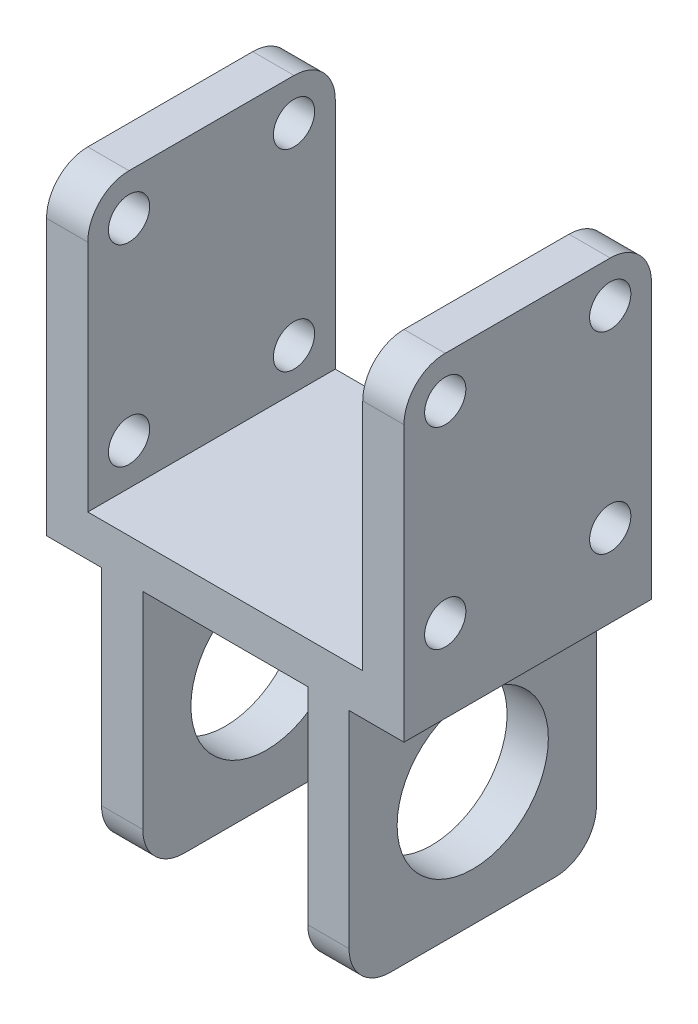
ISO-10303-21;
HEADER;
FILE_DESCRIPTION(('STEP AP214'),'2;1');
FILE_NAME('part.step','',(''),(''),'','','');
FILE_SCHEMA(('AUTOMOTIVE_DESIGN { 1 0 10303 214 1 1 1 1 }'));
ENDSEC;
DATA;
#1=APPLICATION_CONTEXT('core data for automotive mechanical design processes');
#2=APPLICATION_PROTOCOL_DEFINITION('international standard','automotive_design',2000,#1);
#3=PRODUCT_CONTEXT('',#1,'mechanical');
#4=PRODUCT('Part','Part','',(#3));
#5=PRODUCT_RELATED_PRODUCT_CATEGORY('part','',(#4));
#6=PRODUCT_DEFINITION_FORMATION('','',#4);
#7=PRODUCT_DEFINITION_CONTEXT('part definition',#1,'design');
#8=PRODUCT_DEFINITION('design','',#6,#7);
#9=PRODUCT_DEFINITION_SHAPE('','',#8);
#10=(LENGTH_UNIT() NAMED_UNIT(*) SI_UNIT(.MILLI.,.METRE.));
#11=(NAMED_UNIT(*) PLANE_ANGLE_UNIT() SI_UNIT($,.RADIAN.));
#12=(NAMED_UNIT(*) SI_UNIT($,.STERADIAN.) SOLID_ANGLE_UNIT());
#13=UNCERTAINTY_MEASURE_WITH_UNIT(LENGTH_MEASURE(1.E-05),#10,'distance_accuracy_value','');
#14=(GEOMETRIC_REPRESENTATION_CONTEXT(3) GLOBAL_UNCERTAINTY_ASSIGNED_CONTEXT((#13)) GLOBAL_UNIT_ASSIGNED_CONTEXT((#10,
#11,#12)) REPRESENTATION_CONTEXT('',''));
#15=CARTESIAN_POINT('',(0.,0.,0.));
#16=DIRECTION('',(0.,0.,1.));
#17=DIRECTION('',(1.,0.,0.));
#18=AXIS2_PLACEMENT_3D('',#15,#16,#17);
#19=CARTESIAN_POINT('',(0.,0.,0.));
#20=DIRECTION('',(0.,-1.,0.));
#21=DIRECTION('',(0.,0.,-1.));
#22=AXIS2_PLACEMENT_3D('',#19,#20,#21);
#23=PLANE('',#22);
#24=DIRECTION('',(1.,0.,0.));
#25=VECTOR('',#24,1.);
#26=CARTESIAN_POINT('',(-13.,0.,9.));
#27=LINE('',#26,#25);
#28=CARTESIAN_POINT('',(9.,0.,9.));
#29=VERTEX_POINT('',#28);
#30=CARTESIAN_POINT('',(13.,0.,9.));
#31=VERTEX_POINT('',#30);
#32=EDGE_CURVE('E200',#29,#31,#27,.T.);
#33=ORIENTED_EDGE('',*,*,#32,.F.);
#34=DIRECTION('',(0.,0.,1.));
#35=VECTOR('',#34,1.);
#36=CARTESIAN_POINT('',(9.,0.,9.));
#37=LINE('',#36,#35);
#38=CARTESIAN_POINT('',(9.,0.,-9.));
#39=VERTEX_POINT('',#38);
#40=EDGE_CURVE('E210',#39,#29,#37,.T.);
#41=ORIENTED_EDGE('',*,*,#40,.F.);
#42=DIRECTION('',(-1.,0.,0.));
#43=VECTOR('',#42,1.);
#44=CARTESIAN_POINT('',(-13.,0.,-9.));
#45=LINE('',#44,#43);
#46=CARTESIAN_POINT('',(13.,0.,-9.));
#47=VERTEX_POINT('',#46);
#48=EDGE_CURVE('E228',#47,#39,#45,.T.);
#49=ORIENTED_EDGE('',*,*,#48,.F.);
#50=DIRECTION('',(0.,0.,-1.));
#51=VECTOR('',#50,1.);
#52=CARTESIAN_POINT('',(13.,0.,9.));
#53=LINE('',#52,#51);
#54=EDGE_CURVE('E221',#31,#47,#53,.T.);
#55=ORIENTED_EDGE('',*,*,#54,.F.);
#56=EDGE_LOOP('',(#33,#41,#49,#55));
#57=FACE_BOUND('',#56,.T.);
#58=ADVANCED_FACE('F35',(#57),#23,.T.);
#59=CARTESIAN_POINT('',(5.99999999999999,0.,-9.));
#60=VERTEX_POINT('',#59);
#61=CARTESIAN_POINT('',(-6.,0.,-9.));
#62=VERTEX_POINT('',#61);
#63=EDGE_CURVE('E252',#60,#62,#45,.T.);
#64=ORIENTED_EDGE('',*,*,#63,.F.);
#65=DIRECTION('',(0.,0.,-1.));
#66=VECTOR('',#65,1.);
#67=CARTESIAN_POINT('',(6.,0.,9.));
#68=LINE('',#67,#66);
#69=CARTESIAN_POINT('',(6.,0.,9.));
#70=VERTEX_POINT('',#69);
#71=EDGE_CURVE('E217',#70,#60,#68,.T.);
#72=ORIENTED_EDGE('',*,*,#71,.F.);
#73=CARTESIAN_POINT('',(-6.,0.,9.));
#74=VERTEX_POINT('',#73);
#75=EDGE_CURVE('E222',#74,#70,#27,.T.);
#76=ORIENTED_EDGE('',*,*,#75,.F.);
#77=DIRECTION('',(0.,0.,1.));
#78=VECTOR('',#77,1.);
#79=CARTESIAN_POINT('',(-6.,0.,9.));
#80=LINE('',#79,#78);
#81=EDGE_CURVE('E395',#62,#74,#80,.T.);
#82=ORIENTED_EDGE('',*,*,#81,.F.);
#83=EDGE_LOOP('',(#64,#72,#76,#82));
#84=FACE_BOUND('',#83,.T.);
#85=ADVANCED_FACE('F471',(#84),#23,.T.);
#86=DIRECTION('',(0.,0.,-1.));
#87=VECTOR('',#86,1.);
#88=CARTESIAN_POINT('',(-9.,0.,9.));
#89=LINE('',#88,#87);
#90=CARTESIAN_POINT('',(-9.,0.,9.));
#91=VERTEX_POINT('',#90);
#92=CARTESIAN_POINT('',(-9.,0.,-9.));
#93=VERTEX_POINT('',#92);
#94=EDGE_CURVE('E206',#91,#93,#89,.T.);
#95=ORIENTED_EDGE('',*,*,#94,.F.);
#96=CARTESIAN_POINT('',(-13.,0.,9.));
#97=VERTEX_POINT('',#96);
#98=EDGE_CURVE('E225',#97,#91,#27,.T.);
#99=ORIENTED_EDGE('',*,*,#98,.F.);
#100=DIRECTION('',(0.,0.,1.));
#101=VECTOR('',#100,1.);
#102=CARTESIAN_POINT('',(-13.,0.,9.));
#103=LINE('',#102,#101);
#104=CARTESIAN_POINT('',(-13.,0.,-9.));
#105=VERTEX_POINT('',#104);
#106=EDGE_CURVE('E223',#105,#97,#103,.T.);
#107=ORIENTED_EDGE('',*,*,#106,.F.);
#108=EDGE_CURVE('E251',#93,#105,#45,.T.);
#109=ORIENTED_EDGE('',*,*,#108,.F.);
#110=EDGE_LOOP('',(#95,#99,#107,#109));
#111=FACE_BOUND('',#110,.T.);
#112=ADVANCED_FACE('F265',(#111),#23,.T.);
#113=CARTESIAN_POINT('',(0.,3.,0.));
#114=DIRECTION('',(0.,-1.,0.));
#115=DIRECTION('',(0.,0.,-1.));
#116=AXIS2_PLACEMENT_3D('',#113,#114,#115);
#117=PLANE('',#116);
#118=DIRECTION('',(0.,0.,1.));
#119=VECTOR('',#118,1.);
#120=CARTESIAN_POINT('',(10.,3.,-9.));
#121=LINE('',#120,#119);
#122=CARTESIAN_POINT('',(9.99999999999999,3.,-9.));
#123=VERTEX_POINT('',#122);
#124=CARTESIAN_POINT('',(9.99999999999999,3.,9.));
#125=VERTEX_POINT('',#124);
#126=EDGE_CURVE('E408',#123,#125,#121,.T.);
#127=ORIENTED_EDGE('',*,*,#126,.F.);
#128=DIRECTION('',(-1.,0.,0.));
#129=VECTOR('',#128,1.);
#130=CARTESIAN_POINT('',(-13.,3.,-9.));
#131=LINE('',#130,#129);
#132=CARTESIAN_POINT('',(-10.,3.,-9.));
#133=VERTEX_POINT('',#132);
#134=EDGE_CURVE('E232',#123,#133,#131,.T.);
#135=ORIENTED_EDGE('',*,*,#134,.T.);
#136=DIRECTION('',(0.,0.,-1.));
#137=VECTOR('',#136,1.);
#138=CARTESIAN_POINT('',(-10.,3.,-9.));
#139=LINE('',#138,#137);
#140=CARTESIAN_POINT('',(-10.,3.,9.));
#141=VERTEX_POINT('',#140);
#142=EDGE_CURVE('E421',#141,#133,#139,.T.);
#143=ORIENTED_EDGE('',*,*,#142,.F.);
#144=DIRECTION('',(1.,0.,0.));
#145=VECTOR('',#144,1.);
#146=CARTESIAN_POINT('',(-13.,3.,9.));
#147=LINE('',#146,#145);
#148=EDGE_CURVE('E236',#141,#125,#147,.T.);
#149=ORIENTED_EDGE('',*,*,#148,.T.);
#150=EDGE_LOOP('',(#127,#135,#143,#149));
#151=FACE_BOUND('',#150,.T.);
#152=ADVANCED_FACE('F436',(#151),#117,.F.);
#153=CARTESIAN_POINT('',(13.,3.,9.));
#154=DIRECTION('',(-1.,0.,0.));
#155=DIRECTION('',(0.,0.,1.));
#156=AXIS2_PLACEMENT_3D('',#153,#154,#155);
#157=PLANE('',#156);
#158=CARTESIAN_POINT('',(13.,6.,-6.));
#159=DIRECTION('',(-1.,0.,0.));
#160=DIRECTION('',(0.,0.,-1.));
#161=AXIS2_PLACEMENT_3D('',#158,#159,#160);
#162=CIRCLE('',#161,1.5);
#163=CARTESIAN_POINT('',(13.,6.,-7.5));
#164=VERTEX_POINT('',#163);
#165=EDGE_CURVE('E563',#164,#164,#162,.T.);
#166=ORIENTED_EDGE('',*,*,#165,.T.);
#167=EDGE_LOOP('',(#166));
#168=FACE_BOUND('',#167,.T.);
#169=CARTESIAN_POINT('',(13.,6.,6.));
#170=DIRECTION('',(-1.,0.,0.));
#171=DIRECTION('',(0.,0.,1.));
#172=AXIS2_PLACEMENT_3D('',#169,#170,#171);
#173=CIRCLE('',#172,1.5);
#174=CARTESIAN_POINT('',(13.,6.,7.5));
#175=VERTEX_POINT('',#174);
#176=EDGE_CURVE('E575',#175,#175,#173,.T.);
#177=ORIENTED_EDGE('',*,*,#176,.T.);
#178=EDGE_LOOP('',(#177));
#179=FACE_BOUND('',#178,.T.);
#180=CARTESIAN_POINT('',(13.,20.,6.));
#181=DIRECTION('',(-1.,0.,0.));
#182=DIRECTION('',(0.,0.,-1.));
#183=AXIS2_PLACEMENT_3D('',#180,#181,#182);
#184=CIRCLE('',#183,1.5);
#185=CARTESIAN_POINT('',(13.,20.,4.5));
#186=VERTEX_POINT('',#185);
#187=EDGE_CURVE('E568',#186,#186,#184,.T.);
#188=ORIENTED_EDGE('',*,*,#187,.T.);
#189=EDGE_LOOP('',(#188));
#190=FACE_BOUND('',#189,.T.);
#191=CARTESIAN_POINT('',(13.,20.,-6.));
#192=DIRECTION('',(-1.,0.,0.));
#193=DIRECTION('',(0.,0.,1.));
#194=AXIS2_PLACEMENT_3D('',#191,#192,#193);
#195=CIRCLE('',#194,1.5);
#196=CARTESIAN_POINT('',(13.,20.,-4.5));
#197=VERTEX_POINT('',#196);
#198=EDGE_CURVE('E283',#197,#197,#195,.T.);
#199=ORIENTED_EDGE('',*,*,#198,.T.);
#200=EDGE_LOOP('',(#199));
#201=FACE_BOUND('',#200,.T.);
#202=DIRECTION('',(0.,0.,-1.));
#203=VECTOR('',#202,1.);
#204=CARTESIAN_POINT('',(13.,23.,-9.));
#205=LINE('',#204,#203);
#206=CARTESIAN_POINT('',(13.,23.,6.));
#207=VERTEX_POINT('',#206);
#208=CARTESIAN_POINT('',(13.,23.,-6.));
#209=VERTEX_POINT('',#208);
#210=EDGE_CURVE('E409',#207,#209,#205,.T.);
#211=ORIENTED_EDGE('',*,*,#210,.F.);
#212=CARTESIAN_POINT('',(13.,20.,6.));
#213=DIRECTION('',(-1.,0.,0.));
#214=DIRECTION('',(0.,0.,1.));
#215=AXIS2_PLACEMENT_3D('',#212,#213,#214);
#216=CIRCLE('',#215,3.);
#217=CARTESIAN_POINT('',(13.,20.,9.));
#218=VERTEX_POINT('',#217);
#219=EDGE_CURVE('E302',#207,#218,#216,.F.);
#220=ORIENTED_EDGE('',*,*,#219,.T.);
#221=DIRECTION('',(0.,-1.,0.));
#222=VECTOR('',#221,1.);
#223=CARTESIAN_POINT('',(13.,3.,9.));
#224=LINE('',#223,#222);
#225=EDGE_CURVE('E244',#218,#31,#224,.T.);
#226=ORIENTED_EDGE('',*,*,#225,.T.);
#227=ORIENTED_EDGE('',*,*,#54,.T.);
#228=DIRECTION('',(0.,-1.,0.));
#229=VECTOR('',#228,1.);
#230=CARTESIAN_POINT('',(13.,3.,-9.));
#231=LINE('',#230,#229);
#232=CARTESIAN_POINT('',(13.,20.,-9.));
#233=VERTEX_POINT('',#232);
#234=EDGE_CURVE('E273',#233,#47,#231,.T.);
#235=ORIENTED_EDGE('',*,*,#234,.F.);
#236=CARTESIAN_POINT('',(13.,20.,-6.));
#237=DIRECTION('',(-1.,0.,0.));
#238=DIRECTION('',(0.,0.,1.));
#239=AXIS2_PLACEMENT_3D('',#236,#237,#238);
#240=CIRCLE('',#239,3.);
#241=EDGE_CURVE('E300',#233,#209,#240,.F.);
#242=ORIENTED_EDGE('',*,*,#241,.T.);
#243=EDGE_LOOP('',(#211,#220,#226,#227,#235,#242));
#244=FACE_BOUND('',#243,.T.);
#245=ADVANCED_FACE('F451',(#168,#179,#190,#201,#244),#157,.F.);
#246=CARTESIAN_POINT('',(-13.,3.,-9.));
#247=DIRECTION('',(0.,0.,1.));
#248=DIRECTION('',(1.,0.,0.));
#249=AXIS2_PLACEMENT_3D('',#246,#247,#248);
#250=PLANE('',#249);
#251=DIRECTION('',(0.,1.,0.));
#252=VECTOR('',#251,1.);
#253=CARTESIAN_POINT('',(-6.,-18.,-9.));
#254=LINE('',#253,#252);
#255=CARTESIAN_POINT('',(-6.,-15.,-9.));
#256=VERTEX_POINT('',#255);
#257=EDGE_CURVE('E405',#256,#62,#254,.T.);
#258=ORIENTED_EDGE('',*,*,#257,.F.);
#259=DIRECTION('',(1.,0.,0.));
#260=VECTOR('',#259,1.);
#261=CARTESIAN_POINT('',(-9.,-15.,-9.));
#262=LINE('',#261,#260);
#263=CARTESIAN_POINT('',(-9.,-15.,-9.));
#264=VERTEX_POINT('',#263);
#265=EDGE_CURVE('E11',#256,#264,#262,.F.);
#266=ORIENTED_EDGE('',*,*,#265,.T.);
#267=DIRECTION('',(0.,1.,0.));
#268=VECTOR('',#267,1.);
#269=CARTESIAN_POINT('',(-9.,-18.,-9.));
#270=LINE('',#269,#268);
#271=EDGE_CURVE('E261',#264,#93,#270,.T.);
#272=ORIENTED_EDGE('',*,*,#271,.T.);
#273=ORIENTED_EDGE('',*,*,#108,.T.);
#274=DIRECTION('',(0.,-1.,0.));
#275=VECTOR('',#274,1.);
#276=CARTESIAN_POINT('',(-13.,3.,-9.));
#277=LINE('',#276,#275);
#278=CARTESIAN_POINT('',(-13.,20.,-9.));
#279=VERTEX_POINT('',#278);
#280=EDGE_CURVE('E259',#279,#105,#277,.T.);
#281=ORIENTED_EDGE('',*,*,#280,.F.);
#282=DIRECTION('',(-1.,0.,0.));
#283=VECTOR('',#282,1.);
#284=CARTESIAN_POINT('',(-10.,20.,-9.));
#285=LINE('',#284,#283);
#286=CARTESIAN_POINT('',(-10.,20.,-9.));
#287=VERTEX_POINT('',#286);
#288=EDGE_CURVE('E312',#279,#287,#285,.F.);
#289=ORIENTED_EDGE('',*,*,#288,.T.);
#290=DIRECTION('',(0.,-1.,0.));
#291=VECTOR('',#290,1.);
#292=CARTESIAN_POINT('',(-10.,23.,-9.));
#293=LINE('',#292,#291);
#294=EDGE_CURVE('E428',#287,#133,#293,.T.);
#295=ORIENTED_EDGE('',*,*,#294,.T.);
#296=ORIENTED_EDGE('',*,*,#134,.F.);
#297=DIRECTION('',(0.,-1.,0.));
#298=VECTOR('',#297,1.);
#299=CARTESIAN_POINT('',(10.,23.,-9.));
#300=LINE('',#299,#298);
#301=CARTESIAN_POINT('',(10.,20.,-9.));
#302=VERTEX_POINT('',#301);
#303=EDGE_CURVE('E419',#302,#123,#300,.T.);
#304=ORIENTED_EDGE('',*,*,#303,.F.);
#305=DIRECTION('',(-1.,0.,0.));
#306=VECTOR('',#305,1.);
#307=CARTESIAN_POINT('',(-13.,20.,-9.));
#308=LINE('',#307,#306);
#309=EDGE_CURVE('E314',#302,#233,#308,.F.);
#310=ORIENTED_EDGE('',*,*,#309,.T.);
#311=ORIENTED_EDGE('',*,*,#234,.T.);
#312=ORIENTED_EDGE('',*,*,#48,.T.);
#313=DIRECTION('',(0.,1.,0.));
#314=VECTOR('',#313,1.);
#315=CARTESIAN_POINT('',(9.,-18.,-9.));
#316=LINE('',#315,#314);
#317=CARTESIAN_POINT('',(9.,-15.,-9.));
#318=VERTEX_POINT('',#317);
#319=EDGE_CURVE('E213',#318,#39,#316,.T.);
#320=ORIENTED_EDGE('',*,*,#319,.F.);
#321=DIRECTION('',(1.,0.,0.));
#322=VECTOR('',#321,1.);
#323=CARTESIAN_POINT('',(-13.,-15.,-9.));
#324=LINE('',#323,#322);
#325=CARTESIAN_POINT('',(6.,-15.,-9.));
#326=VERTEX_POINT('',#325);
#327=EDGE_CURVE('E43',#318,#326,#324,.F.);
#328=ORIENTED_EDGE('',*,*,#327,.T.);
#329=DIRECTION('',(0.,1.,0.));
#330=VECTOR('',#329,1.);
#331=CARTESIAN_POINT('',(6.,-18.,-9.));
#332=LINE('',#331,#330);
#333=EDGE_CURVE('E364',#326,#60,#332,.T.);
#334=ORIENTED_EDGE('',*,*,#333,.T.);
#335=ORIENTED_EDGE('',*,*,#63,.T.);
#336=EDGE_LOOP('',(#258,#266,#272,#273,#281,#289,#295,#296,#304,#310,#311,#312,#320,#328,#334,#335));
#337=FACE_BOUND('',#336,.T.);
#338=ADVANCED_FACE('F258',(#337),#250,.F.);
#339=CARTESIAN_POINT('',(-13.,3.,9.));
#340=DIRECTION('',(1.,0.,0.));
#341=DIRECTION('',(0.,0.,-1.));
#342=AXIS2_PLACEMENT_3D('',#339,#340,#341);
#343=PLANE('',#342);
#344=CARTESIAN_POINT('',(-13.,6.,-6.));
#345=DIRECTION('',(-1.,0.,0.));
#346=DIRECTION('',(0.,0.,-1.));
#347=AXIS2_PLACEMENT_3D('',#344,#345,#346);
#348=CIRCLE('',#347,1.5);
#349=CARTESIAN_POINT('',(-13.,6.,-7.5));
#350=VERTEX_POINT('',#349);
#351=EDGE_CURVE('E560',#350,#350,#348,.T.);
#352=ORIENTED_EDGE('',*,*,#351,.F.);
#353=EDGE_LOOP('',(#352));
#354=FACE_BOUND('',#353,.T.);
#355=CARTESIAN_POINT('',(-13.,6.,6.));
#356=DIRECTION('',(-1.,0.,0.));
#357=DIRECTION('',(0.,0.,1.));
#358=AXIS2_PLACEMENT_3D('',#355,#356,#357);
#359=CIRCLE('',#358,1.5);
#360=CARTESIAN_POINT('',(-13.,6.,7.5));
#361=VERTEX_POINT('',#360);
#362=EDGE_CURVE('E578',#361,#361,#359,.T.);
#363=ORIENTED_EDGE('',*,*,#362,.F.);
#364=EDGE_LOOP('',(#363));
#365=FACE_BOUND('',#364,.T.);
#366=CARTESIAN_POINT('',(-13.,20.,6.));
#367=DIRECTION('',(-1.,0.,0.));
#368=DIRECTION('',(0.,0.,-1.));
#369=AXIS2_PLACEMENT_3D('',#366,#367,#368);
#370=CIRCLE('',#369,1.5);
#371=CARTESIAN_POINT('',(-13.,20.,4.5));
#372=VERTEX_POINT('',#371);
#373=EDGE_CURVE('E572',#372,#372,#370,.T.);
#374=ORIENTED_EDGE('',*,*,#373,.F.);
#375=EDGE_LOOP('',(#374));
#376=FACE_BOUND('',#375,.T.);
#377=CARTESIAN_POINT('',(-13.,20.,-6.));
#378=DIRECTION('',(-1.,0.,0.));
#379=DIRECTION('',(0.,0.,1.));
#380=AXIS2_PLACEMENT_3D('',#377,#378,#379);
#381=CIRCLE('',#380,1.5);
#382=CARTESIAN_POINT('',(-13.,20.,-4.5));
#383=VERTEX_POINT('',#382);
#384=EDGE_CURVE('E571',#383,#383,#381,.T.);
#385=ORIENTED_EDGE('',*,*,#384,.F.);
#386=EDGE_LOOP('',(#385));
#387=FACE_BOUND('',#386,.T.);
#388=DIRECTION('',(0.,0.,1.));
#389=VECTOR('',#388,1.);
#390=CARTESIAN_POINT('',(-13.,23.,-9.));
#391=LINE('',#390,#389);
#392=CARTESIAN_POINT('',(-13.,23.,-6.));
#393=VERTEX_POINT('',#392);
#394=CARTESIAN_POINT('',(-13.,23.,6.));
#395=VERTEX_POINT('',#394);
#396=EDGE_CURVE('E422',#393,#395,#391,.T.);
#397=ORIENTED_EDGE('',*,*,#396,.F.);
#398=CARTESIAN_POINT('',(-13.,20.,-6.));
#399=DIRECTION('',(1.,0.,0.));
#400=DIRECTION('',(0.,0.,-1.));
#401=AXIS2_PLACEMENT_3D('',#398,#399,#400);
#402=CIRCLE('',#401,3.);
#403=EDGE_CURVE('E272',#393,#279,#402,.F.);
#404=ORIENTED_EDGE('',*,*,#403,.T.);
#405=ORIENTED_EDGE('',*,*,#280,.T.);
#406=ORIENTED_EDGE('',*,*,#106,.T.);
#407=DIRECTION('',(0.,-1.,0.));
#408=VECTOR('',#407,1.);
#409=CARTESIAN_POINT('',(-13.,3.,9.));
#410=LINE('',#409,#408);
#411=CARTESIAN_POINT('',(-13.,20.,9.));
#412=VERTEX_POINT('',#411);
#413=EDGE_CURVE('E270',#412,#97,#410,.T.);
#414=ORIENTED_EDGE('',*,*,#413,.F.);
#415=CARTESIAN_POINT('',(-13.,20.,6.));
#416=DIRECTION('',(1.,0.,0.));
#417=DIRECTION('',(0.,0.,-1.));
#418=AXIS2_PLACEMENT_3D('',#415,#416,#417);
#419=CIRCLE('',#418,3.);
#420=EDGE_CURVE('E322',#412,#395,#419,.F.);
#421=ORIENTED_EDGE('',*,*,#420,.T.);
#422=EDGE_LOOP('',(#397,#404,#405,#406,#414,#421));
#423=FACE_BOUND('',#422,.T.);
#424=ADVANCED_FACE('F269',(#354,#365,#376,#387,#423),#343,.F.);
#425=CARTESIAN_POINT('',(-13.,3.,9.));
#426=DIRECTION('',(0.,0.,-1.));
#427=DIRECTION('',(-1.,0.,0.));
#428=AXIS2_PLACEMENT_3D('',#425,#426,#427);
#429=PLANE('',#428);
#430=DIRECTION('',(0.,1.,0.));
#431=VECTOR('',#430,1.);
#432=CARTESIAN_POINT('',(6.,-18.,9.));
#433=LINE('',#432,#431);
#434=CARTESIAN_POINT('',(6.,-15.,9.));
#435=VERTEX_POINT('',#434);
#436=EDGE_CURVE('E207',#435,#70,#433,.T.);
#437=ORIENTED_EDGE('',*,*,#436,.F.);
#438=DIRECTION('',(-1.,0.,0.));
#439=VECTOR('',#438,1.);
#440=CARTESIAN_POINT('',(-13.,-15.,9.));
#441=LINE('',#440,#439);
#442=CARTESIAN_POINT('',(9.,-15.,9.));
#443=VERTEX_POINT('',#442);
#444=EDGE_CURVE('E203',#435,#443,#441,.F.);
#445=ORIENTED_EDGE('',*,*,#444,.T.);
#446=DIRECTION('',(0.,1.,0.));
#447=VECTOR('',#446,1.);
#448=CARTESIAN_POINT('',(9.,-18.,9.));
#449=LINE('',#448,#447);
#450=EDGE_CURVE('E194',#443,#29,#449,.T.);
#451=ORIENTED_EDGE('',*,*,#450,.T.);
#452=ORIENTED_EDGE('',*,*,#32,.T.);
#453=ORIENTED_EDGE('',*,*,#225,.F.);
#454=DIRECTION('',(1.,0.,0.));
#455=VECTOR('',#454,1.);
#456=CARTESIAN_POINT('',(-13.,20.,9.));
#457=LINE('',#456,#455);
#458=CARTESIAN_POINT('',(10.,20.,9.));
#459=VERTEX_POINT('',#458);
#460=EDGE_CURVE('E306',#218,#459,#457,.F.);
#461=ORIENTED_EDGE('',*,*,#460,.T.);
#462=DIRECTION('',(0.,-1.,0.));
#463=VECTOR('',#462,1.);
#464=CARTESIAN_POINT('',(10.,23.,9.));
#465=LINE('',#464,#463);
#466=EDGE_CURVE('E415',#459,#125,#465,.T.);
#467=ORIENTED_EDGE('',*,*,#466,.T.);
#468=ORIENTED_EDGE('',*,*,#148,.F.);
#469=DIRECTION('',(0.,-1.,0.));
#470=VECTOR('',#469,1.);
#471=CARTESIAN_POINT('',(-9.99999999999999,23.,9.));
#472=LINE('',#471,#470);
#473=CARTESIAN_POINT('',(-9.99999999999999,20.,9.));
#474=VERTEX_POINT('',#473);
#475=EDGE_CURVE('E247',#474,#141,#472,.T.);
#476=ORIENTED_EDGE('',*,*,#475,.F.);
#477=DIRECTION('',(1.,0.,0.));
#478=VECTOR('',#477,1.);
#479=CARTESIAN_POINT('',(-13.,20.,9.));
#480=LINE('',#479,#478);
#481=EDGE_CURVE('E304',#474,#412,#480,.F.);
#482=ORIENTED_EDGE('',*,*,#481,.T.);
#483=ORIENTED_EDGE('',*,*,#413,.T.);
#484=ORIENTED_EDGE('',*,*,#98,.T.);
#485=DIRECTION('',(0.,1.,0.));
#486=VECTOR('',#485,1.);
#487=CARTESIAN_POINT('',(-9.,-18.,9.));
#488=LINE('',#487,#486);
#489=CARTESIAN_POINT('',(-9.,-15.,9.));
#490=VERTEX_POINT('',#489);
#491=EDGE_CURVE('E398',#490,#91,#488,.T.);
#492=ORIENTED_EDGE('',*,*,#491,.F.);
#493=DIRECTION('',(-1.,0.,0.));
#494=VECTOR('',#493,1.);
#495=CARTESIAN_POINT('',(-6.,-15.,9.));
#496=LINE('',#495,#494);
#497=CARTESIAN_POINT('',(-6.,-15.,9.));
#498=VERTEX_POINT('',#497);
#499=EDGE_CURVE('E343',#490,#498,#496,.F.);
#500=ORIENTED_EDGE('',*,*,#499,.T.);
#501=DIRECTION('',(0.,1.,0.));
#502=VECTOR('',#501,1.);
#503=CARTESIAN_POINT('',(-6.,-18.,9.));
#504=LINE('',#503,#502);
#505=EDGE_CURVE('E403',#498,#74,#504,.T.);
#506=ORIENTED_EDGE('',*,*,#505,.T.);
#507=ORIENTED_EDGE('',*,*,#75,.T.);
#508=EDGE_LOOP('',(#437,#445,#451,#452,#453,#461,#467,#468,#476,#482,#483,#484,#492,#500,#506,#507));
#509=FACE_BOUND('',#508,.T.);
#510=ADVANCED_FACE('F197',(#509),#429,.F.);
#511=CARTESIAN_POINT('',(-10.,23.,-9.));
#512=DIRECTION('',(-1.,0.,0.));
#513=DIRECTION('',(0.,0.,1.));
#514=AXIS2_PLACEMENT_3D('',#511,#512,#513);
#515=PLANE('',#514);
#516=CARTESIAN_POINT('',(-10.,6.,-6.));
#517=DIRECTION('',(-1.,0.,0.));
#518=DIRECTION('',(0.,0.,1.));
#519=AXIS2_PLACEMENT_3D('',#516,#517,#518);
#520=CIRCLE('',#519,1.5);
#521=CARTESIAN_POINT('',(-10.,6.,-4.5));
#522=VERTEX_POINT('',#521);
#523=EDGE_CURVE('E218',#522,#522,#520,.T.);
#524=ORIENTED_EDGE('',*,*,#523,.T.);
#525=EDGE_LOOP('',(#524));
#526=FACE_BOUND('',#525,.T.);
#527=CARTESIAN_POINT('',(-9.99999999999999,6.,6.));
#528=DIRECTION('',(-1.,0.,0.));
#529=DIRECTION('',(0.,0.,1.));
#530=AXIS2_PLACEMENT_3D('',#527,#528,#529);
#531=CIRCLE('',#530,1.5);
#532=CARTESIAN_POINT('',(-9.99999999999999,6.,7.5));
#533=VERTEX_POINT('',#532);
#534=EDGE_CURVE('E291',#533,#533,#531,.T.);
#535=ORIENTED_EDGE('',*,*,#534,.T.);
#536=EDGE_LOOP('',(#535));
#537=FACE_BOUND('',#536,.T.);
#538=CARTESIAN_POINT('',(-9.99999999999999,20.,6.));
#539=DIRECTION('',(-1.,0.,0.));
#540=DIRECTION('',(0.,0.,1.));
#541=AXIS2_PLACEMENT_3D('',#538,#539,#540);
#542=CIRCLE('',#541,1.5);
#543=CARTESIAN_POINT('',(-9.99999999999999,20.,7.5));
#544=VERTEX_POINT('',#543);
#545=EDGE_CURVE('E287',#544,#544,#542,.T.);
#546=ORIENTED_EDGE('',*,*,#545,.T.);
#547=EDGE_LOOP('',(#546));
#548=FACE_BOUND('',#547,.T.);
#549=CARTESIAN_POINT('',(-10.,20.,-6.));
#550=DIRECTION('',(-1.,0.,0.));
#551=DIRECTION('',(0.,0.,1.));
#552=AXIS2_PLACEMENT_3D('',#549,#550,#551);
#553=CIRCLE('',#552,1.5);
#554=CARTESIAN_POINT('',(-10.,20.,-4.5));
#555=VERTEX_POINT('',#554);
#556=EDGE_CURVE('E282',#555,#555,#553,.T.);
#557=ORIENTED_EDGE('',*,*,#556,.T.);
#558=EDGE_LOOP('',(#557));
#559=FACE_BOUND('',#558,.T.);
#560=ORIENTED_EDGE('',*,*,#294,.F.);
#561=CARTESIAN_POINT('',(-10.,20.,-6.));
#562=DIRECTION('',(-1.,0.,0.));
#563=DIRECTION('',(0.,0.,1.));
#564=AXIS2_PLACEMENT_3D('',#561,#562,#563);
#565=CIRCLE('',#564,3.);
#566=CARTESIAN_POINT('',(-10.,23.,-6.));
#567=VERTEX_POINT('',#566);
#568=EDGE_CURVE('E327',#287,#567,#565,.F.);
#569=ORIENTED_EDGE('',*,*,#568,.T.);
#570=DIRECTION('',(0.,0.,-1.));
#571=VECTOR('',#570,1.);
#572=CARTESIAN_POINT('',(-10.,23.,-9.));
#573=LINE('',#572,#571);
#574=CARTESIAN_POINT('',(-9.99999999999999,23.,6.));
#575=VERTEX_POINT('',#574);
#576=EDGE_CURVE('E425',#575,#567,#573,.T.);
#577=ORIENTED_EDGE('',*,*,#576,.F.);
#578=CARTESIAN_POINT('',(-9.99999999999999,20.,6.));
#579=DIRECTION('',(-1.,0.,0.));
#580=DIRECTION('',(0.,0.,1.));
#581=AXIS2_PLACEMENT_3D('',#578,#579,#580);
#582=CIRCLE('',#581,3.);
#583=EDGE_CURVE('E325',#575,#474,#582,.F.);
#584=ORIENTED_EDGE('',*,*,#583,.T.);
#585=ORIENTED_EDGE('',*,*,#475,.T.);
#586=ORIENTED_EDGE('',*,*,#142,.T.);
#587=EDGE_LOOP('',(#560,#569,#577,#584,#585,#586));
#588=FACE_BOUND('',#587,.T.);
#589=ADVANCED_FACE('F432',(#526,#537,#548,#559,#588),#515,.F.);
#590=CARTESIAN_POINT('',(0.,23.,0.));
#591=DIRECTION('',(0.,1.,0.));
#592=DIRECTION('',(0.,0.,1.));
#593=AXIS2_PLACEMENT_3D('',#590,#591,#592);
#594=PLANE('',#593);
#595=ORIENTED_EDGE('',*,*,#576,.T.);
#596=DIRECTION('',(-1.,0.,0.));
#597=VECTOR('',#596,1.);
#598=CARTESIAN_POINT('',(-13.,23.,-6.));
#599=LINE('',#598,#597);
#600=EDGE_CURVE('E319',#567,#393,#599,.T.);
#601=ORIENTED_EDGE('',*,*,#600,.T.);
#602=ORIENTED_EDGE('',*,*,#396,.T.);
#603=DIRECTION('',(1.,0.,0.));
#604=VECTOR('',#603,1.);
#605=CARTESIAN_POINT('',(-9.99999999999999,23.,6.));
#606=LINE('',#605,#604);
#607=EDGE_CURVE('E316',#395,#575,#606,.T.);
#608=ORIENTED_EDGE('',*,*,#607,.T.);
#609=EDGE_LOOP('',(#595,#601,#602,#608));
#610=FACE_BOUND('',#609,.T.);
#611=ADVANCED_FACE('F491',(#610),#594,.T.);
#612=CARTESIAN_POINT('',(10.,23.,-9.));
#613=DIRECTION('',(1.,0.,0.));
#614=DIRECTION('',(0.,0.,-1.));
#615=AXIS2_PLACEMENT_3D('',#612,#613,#614);
#616=PLANE('',#615);
#617=CARTESIAN_POINT('',(10.,6.,-6.));
#618=DIRECTION('',(1.,0.,0.));
#619=DIRECTION('',(0.,0.,-1.));
#620=AXIS2_PLACEMENT_3D('',#617,#618,#619);
#621=CIRCLE('',#620,1.5);
#622=CARTESIAN_POINT('',(10.,6.,-7.5));
#623=VERTEX_POINT('',#622);
#624=EDGE_CURVE('E292',#623,#623,#621,.T.);
#625=ORIENTED_EDGE('',*,*,#624,.T.);
#626=EDGE_LOOP('',(#625));
#627=FACE_BOUND('',#626,.T.);
#628=CARTESIAN_POINT('',(10.,6.,6.));
#629=DIRECTION('',(1.,0.,0.));
#630=DIRECTION('',(0.,0.,-1.));
#631=AXIS2_PLACEMENT_3D('',#628,#629,#630);
#632=CIRCLE('',#631,1.5);
#633=CARTESIAN_POINT('',(10.,6.,4.5));
#634=VERTEX_POINT('',#633);
#635=EDGE_CURVE('E288',#634,#634,#632,.T.);
#636=ORIENTED_EDGE('',*,*,#635,.T.);
#637=EDGE_LOOP('',(#636));
#638=FACE_BOUND('',#637,.T.);
#639=CARTESIAN_POINT('',(10.,20.,6.));
#640=DIRECTION('',(1.,0.,0.));
#641=DIRECTION('',(0.,0.,-1.));
#642=AXIS2_PLACEMENT_3D('',#639,#640,#641);
#643=CIRCLE('',#642,1.5);
#644=CARTESIAN_POINT('',(10.,20.,4.5));
#645=VERTEX_POINT('',#644);
#646=EDGE_CURVE('E284',#645,#645,#643,.T.);
#647=ORIENTED_EDGE('',*,*,#646,.T.);
#648=EDGE_LOOP('',(#647));
#649=FACE_BOUND('',#648,.T.);
#650=CARTESIAN_POINT('',(10.,20.,-6.));
#651=DIRECTION('',(1.,0.,0.));
#652=DIRECTION('',(0.,0.,-1.));
#653=AXIS2_PLACEMENT_3D('',#650,#651,#652);
#654=CIRCLE('',#653,1.5);
#655=CARTESIAN_POINT('',(10.,20.,-7.5));
#656=VERTEX_POINT('',#655);
#657=EDGE_CURVE('E279',#656,#656,#654,.T.);
#658=ORIENTED_EDGE('',*,*,#657,.T.);
#659=EDGE_LOOP('',(#658));
#660=FACE_BOUND('',#659,.T.);
#661=ORIENTED_EDGE('',*,*,#466,.F.);
#662=CARTESIAN_POINT('',(10.,20.,6.));
#663=DIRECTION('',(1.,0.,0.));
#664=DIRECTION('',(0.,0.,-1.));
#665=AXIS2_PLACEMENT_3D('',#662,#663,#664);
#666=CIRCLE('',#665,3.);
#667=CARTESIAN_POINT('',(10.,23.,6.));
#668=VERTEX_POINT('',#667);
#669=EDGE_CURVE('E310',#459,#668,#666,.F.);
#670=ORIENTED_EDGE('',*,*,#669,.T.);
#671=DIRECTION('',(0.,0.,1.));
#672=VECTOR('',#671,1.);
#673=CARTESIAN_POINT('',(10.,23.,-9.));
#674=LINE('',#673,#672);
#675=CARTESIAN_POINT('',(10.,23.,-6.));
#676=VERTEX_POINT('',#675);
#677=EDGE_CURVE('E412',#676,#668,#674,.T.);
#678=ORIENTED_EDGE('',*,*,#677,.F.);
#679=CARTESIAN_POINT('',(10.,20.,-6.));
#680=DIRECTION('',(1.,0.,0.));
#681=DIRECTION('',(0.,0.,-1.));
#682=AXIS2_PLACEMENT_3D('',#679,#680,#681);
#683=CIRCLE('',#682,3.);
#684=EDGE_CURVE('E308',#676,#302,#683,.F.);
#685=ORIENTED_EDGE('',*,*,#684,.T.);
#686=ORIENTED_EDGE('',*,*,#303,.T.);
#687=ORIENTED_EDGE('',*,*,#126,.T.);
#688=EDGE_LOOP('',(#661,#670,#678,#685,#686,#687));
#689=FACE_BOUND('',#688,.T.);
#690=ADVANCED_FACE('F441',(#627,#638,#649,#660,#689),#616,.F.);
#691=CARTESIAN_POINT('',(0.,23.,0.));
#692=DIRECTION('',(0.,-1.,0.));
#693=DIRECTION('',(0.,0.,-1.));
#694=AXIS2_PLACEMENT_3D('',#691,#692,#693);
#695=PLANE('',#694);
#696=ORIENTED_EDGE('',*,*,#677,.T.);
#697=DIRECTION('',(1.,0.,0.));
#698=VECTOR('',#697,1.);
#699=CARTESIAN_POINT('',(0.,23.,6.));
#700=LINE('',#699,#698);
#701=EDGE_CURVE('E297',#668,#207,#700,.T.);
#702=ORIENTED_EDGE('',*,*,#701,.T.);
#703=ORIENTED_EDGE('',*,*,#210,.T.);
#704=DIRECTION('',(-1.,0.,0.));
#705=VECTOR('',#704,1.);
#706=CARTESIAN_POINT('',(0.,23.,-6.));
#707=LINE('',#706,#705);
#708=EDGE_CURVE('E275',#209,#676,#707,.T.);
#709=ORIENTED_EDGE('',*,*,#708,.T.);
#710=EDGE_LOOP('',(#696,#702,#703,#709));
#711=FACE_BOUND('',#710,.T.);
#712=ADVANCED_FACE('F448',(#711),#695,.F.);
#713=CARTESIAN_POINT('',(-9.,-18.,9.));
#714=DIRECTION('',(1.,0.,0.));
#715=DIRECTION('',(0.,0.,-1.));
#716=AXIS2_PLACEMENT_3D('',#713,#714,#715);
#717=PLANE('',#716);
#718=CARTESIAN_POINT('',(-9.,-9.,0.));
#719=DIRECTION('',(1.,0.,0.));
#720=DIRECTION('',(0.,0.,-1.));
#721=AXIS2_PLACEMENT_3D('',#718,#719,#720);
#722=CIRCLE('',#721,5.5);
#723=CARTESIAN_POINT('',(-9.,-9.,-5.5));
#724=VERTEX_POINT('',#723);
#725=EDGE_CURVE('E559',#724,#724,#722,.T.);
#726=ORIENTED_EDGE('',*,*,#725,.T.);
#727=EDGE_LOOP('',(#726));
#728=FACE_BOUND('',#727,.T.);
#729=DIRECTION('',(0.,0.,-1.));
#730=VECTOR('',#729,1.);
#731=CARTESIAN_POINT('',(-9.,-18.,9.));
#732=LINE('',#731,#730);
#733=CARTESIAN_POINT('',(-9.,-18.,6.));
#734=VERTEX_POINT('',#733);
#735=CARTESIAN_POINT('',(-9.,-18.,-6.));
#736=VERTEX_POINT('',#735);
#737=EDGE_CURVE('E391',#734,#736,#732,.T.);
#738=ORIENTED_EDGE('',*,*,#737,.F.);
#739=CARTESIAN_POINT('',(-9.,-15.,6.));
#740=DIRECTION('',(1.,0.,0.));
#741=DIRECTION('',(0.,0.,-1.));
#742=AXIS2_PLACEMENT_3D('',#739,#740,#741);
#743=CIRCLE('',#742,3.);
#744=EDGE_CURVE('E358',#734,#490,#743,.F.);
#745=ORIENTED_EDGE('',*,*,#744,.T.);
#746=ORIENTED_EDGE('',*,*,#491,.T.);
#747=ORIENTED_EDGE('',*,*,#94,.T.);
#748=ORIENTED_EDGE('',*,*,#271,.F.);
#749=CARTESIAN_POINT('',(-9.,-15.,-6.));
#750=DIRECTION('',(1.,0.,0.));
#751=DIRECTION('',(0.,0.,-1.));
#752=AXIS2_PLACEMENT_3D('',#749,#750,#751);
#753=CIRCLE('',#752,3.);
#754=EDGE_CURVE('E356',#264,#736,#753,.F.);
#755=ORIENTED_EDGE('',*,*,#754,.T.);
#756=EDGE_LOOP('',(#738,#745,#746,#747,#748,#755));
#757=FACE_BOUND('',#756,.T.);
#758=ADVANCED_FACE('F501',(#728,#757),#717,.F.);
#759=CARTESIAN_POINT('',(-6.,-18.,9.));
#760=DIRECTION('',(-1.,0.,0.));
#761=DIRECTION('',(0.,0.,1.));
#762=AXIS2_PLACEMENT_3D('',#759,#760,#761);
#763=PLANE('',#762);
#764=CARTESIAN_POINT('',(-6.,-9.,0.));
#765=DIRECTION('',(-1.,0.,0.));
#766=DIRECTION('',(0.,0.,1.));
#767=AXIS2_PLACEMENT_3D('',#764,#765,#766);
#768=CIRCLE('',#767,5.5);
#769=CARTESIAN_POINT('',(-6.,-9.,5.5));
#770=VERTEX_POINT('',#769);
#771=EDGE_CURVE('E556',#770,#770,#768,.T.);
#772=ORIENTED_EDGE('',*,*,#771,.T.);
#773=EDGE_LOOP('',(#772));
#774=FACE_BOUND('',#773,.T.);
#775=ORIENTED_EDGE('',*,*,#505,.F.);
#776=CARTESIAN_POINT('',(-6.,-15.,6.));
#777=DIRECTION('',(-1.,0.,0.));
#778=DIRECTION('',(0.,0.,1.));
#779=AXIS2_PLACEMENT_3D('',#776,#777,#778);
#780=CIRCLE('',#779,3.);
#781=CARTESIAN_POINT('',(-6.,-18.,6.));
#782=VERTEX_POINT('',#781);
#783=EDGE_CURVE('E361',#498,#782,#780,.F.);
#784=ORIENTED_EDGE('',*,*,#783,.T.);
#785=DIRECTION('',(0.,0.,1.));
#786=VECTOR('',#785,1.);
#787=CARTESIAN_POINT('',(-6.,-18.,9.));
#788=LINE('',#787,#786);
#789=CARTESIAN_POINT('',(-6.,-18.,-6.));
#790=VERTEX_POINT('',#789);
#791=EDGE_CURVE('E394',#790,#782,#788,.T.);
#792=ORIENTED_EDGE('',*,*,#791,.F.);
#793=CARTESIAN_POINT('',(-6.,-15.,-6.));
#794=DIRECTION('',(-1.,0.,0.));
#795=DIRECTION('',(0.,0.,1.));
#796=AXIS2_PLACEMENT_3D('',#793,#794,#795);
#797=CIRCLE('',#796,3.);
#798=EDGE_CURVE('E50',#790,#256,#797,.F.);
#799=ORIENTED_EDGE('',*,*,#798,.T.);
#800=ORIENTED_EDGE('',*,*,#257,.T.);
#801=ORIENTED_EDGE('',*,*,#81,.T.);
#802=EDGE_LOOP('',(#775,#784,#792,#799,#800,#801));
#803=FACE_BOUND('',#802,.T.);
#804=ADVANCED_FACE('F504',(#774,#803),#763,.F.);
#805=CARTESIAN_POINT('',(0.,-18.,0.));
#806=DIRECTION('',(0.,-1.,0.));
#807=DIRECTION('',(0.,0.,-1.));
#808=AXIS2_PLACEMENT_3D('',#805,#806,#807);
#809=PLANE('',#808);
#810=ORIENTED_EDGE('',*,*,#791,.T.);
#811=DIRECTION('',(-1.,0.,0.));
#812=VECTOR('',#811,1.);
#813=CARTESIAN_POINT('',(-9.,-18.,6.));
#814=LINE('',#813,#812);
#815=EDGE_CURVE('E353',#782,#734,#814,.T.);
#816=ORIENTED_EDGE('',*,*,#815,.T.);
#817=ORIENTED_EDGE('',*,*,#737,.T.);
#818=DIRECTION('',(1.,0.,0.));
#819=VECTOR('',#818,1.);
#820=CARTESIAN_POINT('',(-6.,-18.,-6.));
#821=LINE('',#820,#819);
#822=EDGE_CURVE('E350',#736,#790,#821,.T.);
#823=ORIENTED_EDGE('',*,*,#822,.T.);
#824=EDGE_LOOP('',(#810,#816,#817,#823));
#825=FACE_BOUND('',#824,.T.);
#826=ADVANCED_FACE('F508',(#825),#809,.T.);
#827=CARTESIAN_POINT('',(9.,-18.,9.));
#828=DIRECTION('',(-1.,0.,0.));
#829=DIRECTION('',(0.,0.,1.));
#830=AXIS2_PLACEMENT_3D('',#827,#828,#829);
#831=PLANE('',#830);
#832=CARTESIAN_POINT('',(9.,-9.,0.));
#833=DIRECTION('',(-1.,0.,0.));
#834=DIRECTION('',(0.,0.,1.));
#835=AXIS2_PLACEMENT_3D('',#832,#833,#834);
#836=CIRCLE('',#835,5.5);
#837=CARTESIAN_POINT('',(9.,-9.,5.5));
#838=VERTEX_POINT('',#837);
#839=EDGE_CURVE('E333',#838,#838,#836,.T.);
#840=ORIENTED_EDGE('',*,*,#839,.T.);
#841=EDGE_LOOP('',(#840));
#842=FACE_BOUND('',#841,.T.);
#843=ORIENTED_EDGE('',*,*,#450,.F.);
#844=CARTESIAN_POINT('',(9.,-15.,6.));
#845=DIRECTION('',(-1.,0.,0.));
#846=DIRECTION('',(0.,0.,1.));
#847=AXIS2_PLACEMENT_3D('',#844,#845,#846);
#848=CIRCLE('',#847,3.);
#849=CARTESIAN_POINT('',(9.,-18.,6.));
#850=VERTEX_POINT('',#849);
#851=EDGE_CURVE('E348',#443,#850,#848,.F.);
#852=ORIENTED_EDGE('',*,*,#851,.T.);
#853=DIRECTION('',(0.,0.,1.));
#854=VECTOR('',#853,1.);
#855=CARTESIAN_POINT('',(9.,-18.,9.));
#856=LINE('',#855,#854);
#857=CARTESIAN_POINT('',(9.,-18.,-6.));
#858=VERTEX_POINT('',#857);
#859=EDGE_CURVE('E380',#858,#850,#856,.T.);
#860=ORIENTED_EDGE('',*,*,#859,.F.);
#861=CARTESIAN_POINT('',(9.,-15.,-6.));
#862=DIRECTION('',(-1.,0.,0.));
#863=DIRECTION('',(0.,0.,1.));
#864=AXIS2_PLACEMENT_3D('',#861,#862,#863);
#865=CIRCLE('',#864,3.);
#866=EDGE_CURVE('E346',#858,#318,#865,.F.);
#867=ORIENTED_EDGE('',*,*,#866,.T.);
#868=ORIENTED_EDGE('',*,*,#319,.T.);
#869=ORIENTED_EDGE('',*,*,#40,.T.);
#870=EDGE_LOOP('',(#843,#852,#860,#867,#868,#869));
#871=FACE_BOUND('',#870,.T.);
#872=ADVANCED_FACE('F211',(#842,#871),#831,.F.);
#873=CARTESIAN_POINT('',(6.,-18.,9.));
#874=DIRECTION('',(1.,0.,0.));
#875=DIRECTION('',(0.,0.,-1.));
#876=AXIS2_PLACEMENT_3D('',#873,#874,#875);
#877=PLANE('',#876);
#878=CARTESIAN_POINT('',(6.,-9.,0.));
#879=DIRECTION('',(1.,0.,0.));
#880=DIRECTION('',(0.,0.,-1.));
#881=AXIS2_PLACEMENT_3D('',#878,#879,#880);
#882=CIRCLE('',#881,5.5);
#883=CARTESIAN_POINT('',(6.,-9.,-5.5));
#884=VERTEX_POINT('',#883);
#885=EDGE_CURVE('E330',#884,#884,#882,.T.);
#886=ORIENTED_EDGE('',*,*,#885,.T.);
#887=EDGE_LOOP('',(#886));
#888=FACE_BOUND('',#887,.T.);
#889=DIRECTION('',(0.,0.,-1.));
#890=VECTOR('',#889,1.);
#891=CARTESIAN_POINT('',(6.,-18.,9.));
#892=LINE('',#891,#890);
#893=CARTESIAN_POINT('',(6.,-18.,6.));
#894=VERTEX_POINT('',#893);
#895=CARTESIAN_POINT('',(6.,-18.,-6.));
#896=VERTEX_POINT('',#895);
#897=EDGE_CURVE('E382',#894,#896,#892,.T.);
#898=ORIENTED_EDGE('',*,*,#897,.F.);
#899=CARTESIAN_POINT('',(6.,-15.,6.));
#900=DIRECTION('',(1.,0.,0.));
#901=DIRECTION('',(0.,0.,-1.));
#902=AXIS2_PLACEMENT_3D('',#899,#900,#901);
#903=CIRCLE('',#902,3.);
#904=EDGE_CURVE('E341',#894,#435,#903,.F.);
#905=ORIENTED_EDGE('',*,*,#904,.T.);
#906=ORIENTED_EDGE('',*,*,#436,.T.);
#907=ORIENTED_EDGE('',*,*,#71,.T.);
#908=ORIENTED_EDGE('',*,*,#333,.F.);
#909=CARTESIAN_POINT('',(6.,-15.,-6.));
#910=DIRECTION('',(1.,0.,0.));
#911=DIRECTION('',(0.,0.,-1.));
#912=AXIS2_PLACEMENT_3D('',#909,#910,#911);
#913=CIRCLE('',#912,3.);
#914=EDGE_CURVE('E339',#326,#896,#913,.F.);
#915=ORIENTED_EDGE('',*,*,#914,.T.);
#916=EDGE_LOOP('',(#898,#905,#906,#907,#908,#915));
#917=FACE_BOUND('',#916,.T.);
#918=ADVANCED_FACE('F370',(#888,#917),#877,.F.);
#919=CARTESIAN_POINT('',(0.,-18.,0.));
#920=DIRECTION('',(0.,1.,0.));
#921=DIRECTION('',(0.,0.,1.));
#922=AXIS2_PLACEMENT_3D('',#919,#920,#921);
#923=PLANE('',#922);
#924=ORIENTED_EDGE('',*,*,#859,.T.);
#925=DIRECTION('',(-1.,0.,0.));
#926=VECTOR('',#925,1.);
#927=CARTESIAN_POINT('',(0.,-18.,6.));
#928=LINE('',#927,#926);
#929=EDGE_CURVE('E336',#850,#894,#928,.T.);
#930=ORIENTED_EDGE('',*,*,#929,.T.);
#931=ORIENTED_EDGE('',*,*,#897,.T.);
#932=DIRECTION('',(1.,0.,0.));
#933=VECTOR('',#932,1.);
#934=CARTESIAN_POINT('',(0.,-18.,-6.));
#935=LINE('',#934,#933);
#936=EDGE_CURVE('E329',#896,#858,#935,.T.);
#937=ORIENTED_EDGE('',*,*,#936,.T.);
#938=EDGE_LOOP('',(#924,#930,#931,#937));
#939=FACE_BOUND('',#938,.T.);
#940=ADVANCED_FACE('F379',(#939),#923,.F.);
#941=CARTESIAN_POINT('',(13.,20.,-6.));
#942=DIRECTION('',(-1.,0.,0.));
#943=DIRECTION('',(0.,0.,1.));
#944=AXIS2_PLACEMENT_3D('',#941,#942,#943);
#945=CYLINDRICAL_SURFACE('',#944,1.5);
#946=ORIENTED_EDGE('',*,*,#198,.F.);
#947=EDGE_LOOP('',(#946));
#948=FACE_BOUND('',#947,.T.);
#949=ORIENTED_EDGE('',*,*,#657,.F.);
#950=EDGE_LOOP('',(#949));
#951=FACE_BOUND('',#950,.T.);
#952=ADVANCED_FACE('F521',(#948,#951),#945,.F.);
#953=CARTESIAN_POINT('',(13.,20.,6.));
#954=DIRECTION('',(-1.,0.,0.));
#955=DIRECTION('',(0.,0.,1.));
#956=AXIS2_PLACEMENT_3D('',#953,#954,#955);
#957=CYLINDRICAL_SURFACE('',#956,1.5);
#958=ORIENTED_EDGE('',*,*,#187,.F.);
#959=EDGE_LOOP('',(#958));
#960=FACE_BOUND('',#959,.T.);
#961=ORIENTED_EDGE('',*,*,#646,.F.);
#962=EDGE_LOOP('',(#961));
#963=FACE_BOUND('',#962,.T.);
#964=ADVANCED_FACE('F539',(#960,#963),#957,.F.);
#965=CARTESIAN_POINT('',(13.,6.,6.));
#966=DIRECTION('',(-1.,0.,0.));
#967=DIRECTION('',(0.,0.,1.));
#968=AXIS2_PLACEMENT_3D('',#965,#966,#967);
#969=CYLINDRICAL_SURFACE('',#968,1.5);
#970=ORIENTED_EDGE('',*,*,#176,.F.);
#971=EDGE_LOOP('',(#970));
#972=FACE_BOUND('',#971,.T.);
#973=ORIENTED_EDGE('',*,*,#635,.F.);
#974=EDGE_LOOP('',(#973));
#975=FACE_BOUND('',#974,.T.);
#976=ADVANCED_FACE('F535',(#972,#975),#969,.F.);
#977=CARTESIAN_POINT('',(13.,6.,-6.));
#978=DIRECTION('',(-1.,0.,0.));
#979=DIRECTION('',(0.,0.,1.));
#980=AXIS2_PLACEMENT_3D('',#977,#978,#979);
#981=CYLINDRICAL_SURFACE('',#980,1.5);
#982=ORIENTED_EDGE('',*,*,#165,.F.);
#983=EDGE_LOOP('',(#982));
#984=FACE_BOUND('',#983,.T.);
#985=ORIENTED_EDGE('',*,*,#624,.F.);
#986=EDGE_LOOP('',(#985));
#987=FACE_BOUND('',#986,.T.);
#988=ADVANCED_FACE('F526',(#984,#987),#981,.F.);
#989=ORIENTED_EDGE('',*,*,#384,.T.);
#990=EDGE_LOOP('',(#989));
#991=FACE_BOUND('',#990,.T.);
#992=ORIENTED_EDGE('',*,*,#556,.F.);
#993=EDGE_LOOP('',(#992));
#994=FACE_BOUND('',#993,.T.);
#995=ADVANCED_FACE('F522',(#991,#994),#945,.F.);
#996=ORIENTED_EDGE('',*,*,#373,.T.);
#997=EDGE_LOOP('',(#996));
#998=FACE_BOUND('',#997,.T.);
#999=ORIENTED_EDGE('',*,*,#545,.F.);
#1000=EDGE_LOOP('',(#999));
#1001=FACE_BOUND('',#1000,.T.);
#1002=ADVANCED_FACE('F525',(#998,#1001),#957,.F.);
#1003=ORIENTED_EDGE('',*,*,#362,.T.);
#1004=EDGE_LOOP('',(#1003));
#1005=FACE_BOUND('',#1004,.T.);
#1006=ORIENTED_EDGE('',*,*,#534,.F.);
#1007=EDGE_LOOP('',(#1006));
#1008=FACE_BOUND('',#1007,.T.);
#1009=ADVANCED_FACE('F530',(#1005,#1008),#969,.F.);
#1010=ORIENTED_EDGE('',*,*,#351,.T.);
#1011=EDGE_LOOP('',(#1010));
#1012=FACE_BOUND('',#1011,.T.);
#1013=ORIENTED_EDGE('',*,*,#523,.F.);
#1014=EDGE_LOOP('',(#1013));
#1015=FACE_BOUND('',#1014,.T.);
#1016=ADVANCED_FACE('F468',(#1012,#1015),#981,.F.);
#1017=CARTESIAN_POINT('',(0.,20.,6.));
#1018=DIRECTION('',(1.,0.,0.));
#1019=DIRECTION('',(0.,0.,-1.));
#1020=AXIS2_PLACEMENT_3D('',#1017,#1018,#1019);
#1021=CYLINDRICAL_SURFACE('',#1020,3.);
#1022=ORIENTED_EDGE('',*,*,#669,.F.);
#1023=ORIENTED_EDGE('',*,*,#460,.F.);
#1024=ORIENTED_EDGE('',*,*,#219,.F.);
#1025=ORIENTED_EDGE('',*,*,#701,.F.);
#1026=EDGE_LOOP('',(#1022,#1023,#1024,#1025));
#1027=FACE_BOUND('',#1026,.T.);
#1028=ADVANCED_FACE('F445',(#1027),#1021,.T.);
#1029=CARTESIAN_POINT('',(0.,20.,-6.));
#1030=DIRECTION('',(-1.,0.,0.));
#1031=DIRECTION('',(0.,0.,1.));
#1032=AXIS2_PLACEMENT_3D('',#1029,#1030,#1031);
#1033=CYLINDRICAL_SURFACE('',#1032,3.);
#1034=ORIENTED_EDGE('',*,*,#241,.F.);
#1035=ORIENTED_EDGE('',*,*,#309,.F.);
#1036=ORIENTED_EDGE('',*,*,#684,.F.);
#1037=ORIENTED_EDGE('',*,*,#708,.F.);
#1038=EDGE_LOOP('',(#1034,#1035,#1036,#1037));
#1039=FACE_BOUND('',#1038,.T.);
#1040=ADVANCED_FACE('F456',(#1039),#1033,.T.);
#1041=CARTESIAN_POINT('',(0.,20.,-6.));
#1042=DIRECTION('',(1.,0.,0.));
#1043=DIRECTION('',(0.,0.,-1.));
#1044=AXIS2_PLACEMENT_3D('',#1041,#1042,#1043);
#1045=CYLINDRICAL_SURFACE('',#1044,3.);
#1046=ORIENTED_EDGE('',*,*,#568,.F.);
#1047=ORIENTED_EDGE('',*,*,#288,.F.);
#1048=ORIENTED_EDGE('',*,*,#403,.F.);
#1049=ORIENTED_EDGE('',*,*,#600,.F.);
#1050=EDGE_LOOP('',(#1046,#1047,#1048,#1049));
#1051=FACE_BOUND('',#1050,.T.);
#1052=ADVANCED_FACE('F459',(#1051),#1045,.T.);
#1053=CARTESIAN_POINT('',(0.,20.,6.));
#1054=DIRECTION('',(-1.,0.,0.));
#1055=DIRECTION('',(0.,0.,1.));
#1056=AXIS2_PLACEMENT_3D('',#1053,#1054,#1055);
#1057=CYLINDRICAL_SURFACE('',#1056,3.);
#1058=ORIENTED_EDGE('',*,*,#420,.F.);
#1059=ORIENTED_EDGE('',*,*,#481,.F.);
#1060=ORIENTED_EDGE('',*,*,#583,.F.);
#1061=ORIENTED_EDGE('',*,*,#607,.F.);
#1062=EDGE_LOOP('',(#1058,#1059,#1060,#1061));
#1063=FACE_BOUND('',#1062,.T.);
#1064=ADVANCED_FACE('F465',(#1063),#1057,.T.);
#1065=CARTESIAN_POINT('',(13.,-9.,0.));
#1066=DIRECTION('',(-1.,0.,0.));
#1067=DIRECTION('',(0.,0.,1.));
#1068=AXIS2_PLACEMENT_3D('',#1065,#1066,#1067);
#1069=CYLINDRICAL_SURFACE('',#1068,5.5);
#1070=ORIENTED_EDGE('',*,*,#885,.F.);
#1071=EDGE_LOOP('',(#1070));
#1072=FACE_BOUND('',#1071,.T.);
#1073=ORIENTED_EDGE('',*,*,#839,.F.);
#1074=EDGE_LOOP('',(#1073));
#1075=FACE_BOUND('',#1074,.T.);
#1076=ADVANCED_FACE('F543',(#1072,#1075),#1069,.F.);
#1077=ORIENTED_EDGE('',*,*,#771,.F.);
#1078=EDGE_LOOP('',(#1077));
#1079=FACE_BOUND('',#1078,.T.);
#1080=ORIENTED_EDGE('',*,*,#725,.F.);
#1081=EDGE_LOOP('',(#1080));
#1082=FACE_BOUND('',#1081,.T.);
#1083=ADVANCED_FACE('F540',(#1079,#1082),#1069,.F.);
#1084=CARTESIAN_POINT('',(0.,-15.,6.));
#1085=DIRECTION('',(-1.,0.,0.));
#1086=DIRECTION('',(0.,0.,1.));
#1087=AXIS2_PLACEMENT_3D('',#1084,#1085,#1086);
#1088=CYLINDRICAL_SURFACE('',#1087,3.);
#1089=ORIENTED_EDGE('',*,*,#851,.F.);
#1090=ORIENTED_EDGE('',*,*,#444,.F.);
#1091=ORIENTED_EDGE('',*,*,#904,.F.);
#1092=ORIENTED_EDGE('',*,*,#929,.F.);
#1093=EDGE_LOOP('',(#1089,#1090,#1091,#1092));
#1094=FACE_BOUND('',#1093,.T.);
#1095=ADVANCED_FACE('F542',(#1094),#1088,.T.);
#1096=CARTESIAN_POINT('',(0.,-15.,6.));
#1097=DIRECTION('',(1.,0.,0.));
#1098=DIRECTION('',(0.,0.,-1.));
#1099=AXIS2_PLACEMENT_3D('',#1096,#1097,#1098);
#1100=CYLINDRICAL_SURFACE('',#1099,3.);
#1101=ORIENTED_EDGE('',*,*,#783,.F.);
#1102=ORIENTED_EDGE('',*,*,#499,.F.);
#1103=ORIENTED_EDGE('',*,*,#744,.F.);
#1104=ORIENTED_EDGE('',*,*,#815,.F.);
#1105=EDGE_LOOP('',(#1101,#1102,#1103,#1104));
#1106=FACE_BOUND('',#1105,.T.);
#1107=ADVANCED_FACE('F549',(#1106),#1100,.T.);
#1108=CARTESIAN_POINT('',(0.,-15.,-6.));
#1109=DIRECTION('',(-1.,0.,0.));
#1110=DIRECTION('',(0.,0.,1.));
#1111=AXIS2_PLACEMENT_3D('',#1108,#1109,#1110);
#1112=CYLINDRICAL_SURFACE('',#1111,3.);
#1113=ORIENTED_EDGE('',*,*,#754,.F.);
#1114=ORIENTED_EDGE('',*,*,#265,.F.);
#1115=ORIENTED_EDGE('',*,*,#798,.F.);
#1116=ORIENTED_EDGE('',*,*,#822,.F.);
#1117=EDGE_LOOP('',(#1113,#1114,#1115,#1116));
#1118=FACE_BOUND('',#1117,.T.);
#1119=ADVANCED_FACE('F716',(#1118),#1112,.T.);
#1120=CARTESIAN_POINT('',(0.,-15.,-6.));
#1121=DIRECTION('',(1.,0.,0.));
#1122=DIRECTION('',(0.,0.,-1.));
#1123=AXIS2_PLACEMENT_3D('',#1120,#1121,#1122);
#1124=CYLINDRICAL_SURFACE('',#1123,3.);
#1125=ORIENTED_EDGE('',*,*,#914,.F.);
#1126=ORIENTED_EDGE('',*,*,#327,.F.);
#1127=ORIENTED_EDGE('',*,*,#866,.F.);
#1128=ORIENTED_EDGE('',*,*,#936,.F.);
#1129=EDGE_LOOP('',(#1125,#1126,#1127,#1128));
#1130=FACE_BOUND('',#1129,.T.);
#1131=ADVANCED_FACE('F37',(#1130),#1124,.T.);
#1132=CLOSED_SHELL('',(#58,#85,#112,#152,#245,#338,#424,#510,#589,#611,#690,#712,#758,#804,#826,
#872,#918,#940,#952,#964,#976,#988,#995,#1002,#1009,#1016,#1028,#1040,#1052,#1064,#1076,#1083,
#1095,#1107,#1119,#1131));
#1133=MANIFOLD_SOLID_BREP('B2',#1132);
#1134=ADVANCED_BREP_SHAPE_REPRESENTATION('',(#18,#1133),#14);
#1135=SHAPE_DEFINITION_REPRESENTATION(#9,#1134);
ENDSEC;
END-ISO-10303-21;
